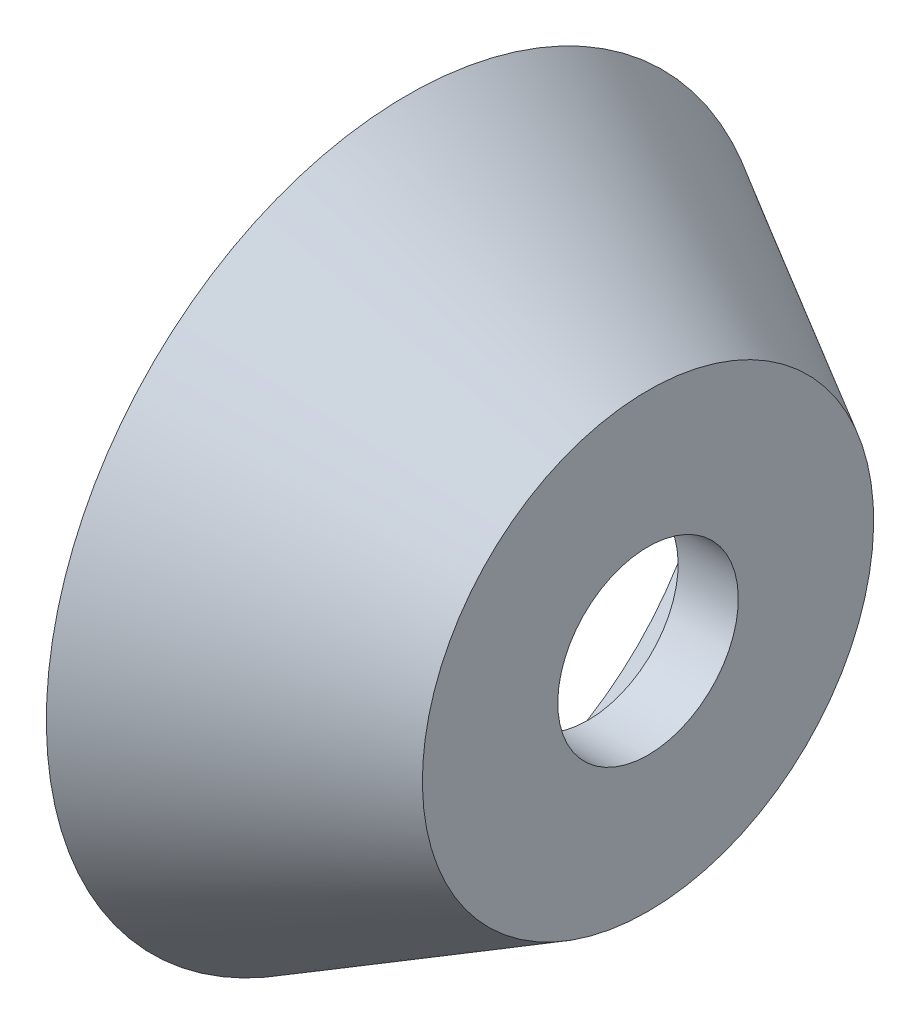
ISO-10303-21;
HEADER;
FILE_DESCRIPTION(('STEP AP214'),'2;1');
FILE_NAME('part.step','',(''),(''),'','','');
FILE_SCHEMA(('AUTOMOTIVE_DESIGN { 1 0 10303 214 1 1 1 1 }'));
ENDSEC;
DATA;
#1=APPLICATION_CONTEXT('core data for automotive mechanical design processes');
#2=APPLICATION_PROTOCOL_DEFINITION('international standard','automotive_design',2000,#1);
#3=PRODUCT_CONTEXT('',#1,'mechanical');
#4=PRODUCT('Part','Part','',(#3));
#5=PRODUCT_RELATED_PRODUCT_CATEGORY('part','',(#4));
#6=PRODUCT_DEFINITION_FORMATION('','',#4);
#7=PRODUCT_DEFINITION_CONTEXT('part definition',#1,'design');
#8=PRODUCT_DEFINITION('design','',#6,#7);
#9=PRODUCT_DEFINITION_SHAPE('','',#8);
#10=(LENGTH_UNIT() NAMED_UNIT(*) SI_UNIT(.MILLI.,.METRE.));
#11=(NAMED_UNIT(*) PLANE_ANGLE_UNIT() SI_UNIT($,.RADIAN.));
#12=(NAMED_UNIT(*) SI_UNIT($,.STERADIAN.) SOLID_ANGLE_UNIT());
#13=UNCERTAINTY_MEASURE_WITH_UNIT(LENGTH_MEASURE(1.E-05),#10,'distance_accuracy_value','');
#14=(GEOMETRIC_REPRESENTATION_CONTEXT(3) GLOBAL_UNCERTAINTY_ASSIGNED_CONTEXT((#13)) GLOBAL_UNIT_ASSIGNED_CONTEXT((#10,
#11,#12)) REPRESENTATION_CONTEXT('',''));
#15=CARTESIAN_POINT('',(0.,0.,0.));
#16=DIRECTION('',(0.,0.,1.));
#17=DIRECTION('',(1.,0.,0.));
#18=AXIS2_PLACEMENT_3D('',#15,#16,#17);
#19=CARTESIAN_POINT('',(6.35,4.7625,0.));
#20=DIRECTION('',(-1.,0.,0.));
#21=DIRECTION('',(0.,-1.,0.));
#22=AXIS2_PLACEMENT_3D('',#19,#20,#21);
#23=PLANE('',#22);
#24=CARTESIAN_POINT('',(6.35,0.,0.));
#25=DIRECTION('',(-1.,0.,0.));
#26=DIRECTION('',(0.,-1.,0.));
#27=AXIS2_PLACEMENT_3D('',#24,#25,#26);
#28=CIRCLE('',#27,11.90625);
#29=CARTESIAN_POINT('',(6.35,-11.90625,0.));
#30=VERTEX_POINT('',#29);
#31=EDGE_CURVE('E64',#30,#30,#28,.T.);
#32=ORIENTED_EDGE('',*,*,#31,.F.);
#33=EDGE_LOOP('',(#32));
#34=FACE_BOUND('',#33,.T.);
#35=CARTESIAN_POINT('',(6.35,0.,0.));
#36=DIRECTION('',(-1.,0.,0.));
#37=DIRECTION('',(0.,-1.,0.));
#38=AXIS2_PLACEMENT_3D('',#35,#36,#37);
#39=CIRCLE('',#38,4.7625);
#40=CARTESIAN_POINT('',(6.35,-4.76250000000001,0.));
#41=VERTEX_POINT('',#40);
#42=EDGE_CURVE('E10',#41,#41,#39,.T.);
#43=ORIENTED_EDGE('',*,*,#42,.T.);
#44=EDGE_LOOP('',(#43));
#45=FACE_BOUND('',#44,.T.);
#46=ADVANCED_FACE('F36',(#34,#45),#23,.F.);
#47=CARTESIAN_POINT('',(-6.35000000000001,0.,0.));
#48=DIRECTION('',(-1.,0.,0.));
#49=DIRECTION('',(0.,-1.,0.));
#50=AXIS2_PLACEMENT_3D('',#47,#48,#49);
#51=CYLINDRICAL_SURFACE('',#50,4.7625);
#52=ORIENTED_EDGE('',*,*,#42,.F.);
#53=EDGE_LOOP('',(#52));
#54=FACE_BOUND('',#53,.T.);
#55=CARTESIAN_POINT('',(3.175,0.,0.));
#56=DIRECTION('',(-1.,0.,0.));
#57=DIRECTION('',(0.,-1.,0.));
#58=AXIS2_PLACEMENT_3D('',#55,#56,#57);
#59=CIRCLE('',#58,4.7625);
#60=CARTESIAN_POINT('',(3.175,-4.7625,0.));
#61=VERTEX_POINT('',#60);
#62=EDGE_CURVE('E43',#61,#61,#59,.T.);
#63=ORIENTED_EDGE('',*,*,#62,.T.);
#64=EDGE_LOOP('',(#63));
#65=FACE_BOUND('',#64,.T.);
#66=ADVANCED_FACE('F71',(#54,#65),#51,.F.);
#67=CARTESIAN_POINT('',(3.175,10.0493592369733,0.));
#68=DIRECTION('',(1.,0.,0.));
#69=DIRECTION('',(0.,1.,0.));
#70=AXIS2_PLACEMENT_3D('',#67,#68,#69);
#71=PLANE('',#70);
#72=ORIENTED_EDGE('',*,*,#62,.F.);
#73=EDGE_LOOP('',(#72));
#74=FACE_BOUND('',#73,.T.);
#75=CARTESIAN_POINT('',(3.175,0.,0.));
#76=DIRECTION('',(-1.,0.,0.));
#77=DIRECTION('',(0.,-1.,0.));
#78=AXIS2_PLACEMENT_3D('',#75,#76,#77);
#79=CIRCLE('',#78,10.0493592369733);
#80=CARTESIAN_POINT('',(3.175,-10.0493592369733,0.));
#81=VERTEX_POINT('',#80);
#82=EDGE_CURVE('E50',#81,#81,#79,.T.);
#83=ORIENTED_EDGE('',*,*,#82,.T.);
#84=EDGE_LOOP('',(#83));
#85=FACE_BOUND('',#84,.T.);
#86=ADVANCED_FACE('F75',(#74,#85),#71,.F.);
#87=CARTESIAN_POINT('',(-4.23333333333334,0.,0.));
#88=DIRECTION('',(-1.,0.,0.));
#89=DIRECTION('',(0.,-1.,0.));
#90=AXIS2_PLACEMENT_3D('',#87,#88,#89);
#91=CONICAL_SURFACE('',#90,14.2165467369733,0.512389460310737);
#92=ORIENTED_EDGE('',*,*,#82,.F.);
#93=EDGE_LOOP('',(#92));
#94=FACE_BOUND('',#93,.T.);
#95=CARTESIAN_POINT('',(-4.23333333333334,0.,0.));
#96=DIRECTION('',(-1.,0.,0.));
#97=DIRECTION('',(0.,-1.,0.));
#98=AXIS2_PLACEMENT_3D('',#95,#96,#97);
#99=CIRCLE('',#98,14.2165467369733);
#100=CARTESIAN_POINT('',(-4.23333333333334,-14.2165467369733,0.));
#101=VERTEX_POINT('',#100);
#102=EDGE_CURVE('E55',#101,#101,#99,.T.);
#103=ORIENTED_EDGE('',*,*,#102,.T.);
#104=EDGE_LOOP('',(#103));
#105=FACE_BOUND('',#104,.T.);
#106=ADVANCED_FACE('F80',(#94,#105),#91,.F.);
#107=CARTESIAN_POINT('',(-6.35,0.,0.));
#108=DIRECTION('',(-1.,0.,0.));
#109=DIRECTION('',(0.,-1.,0.));
#110=AXIS2_PLACEMENT_3D('',#107,#108,#109);
#111=CONICAL_SURFACE('',#110,19.05,1.15803327372149);
#112=ORIENTED_EDGE('',*,*,#102,.F.);
#113=EDGE_LOOP('',(#112));
#114=FACE_BOUND('',#113,.T.);
#115=CARTESIAN_POINT('',(-6.35,0.,0.));
#116=DIRECTION('',(-1.,0.,0.));
#117=DIRECTION('',(0.,-1.,0.));
#118=AXIS2_PLACEMENT_3D('',#115,#116,#117);
#119=CIRCLE('',#118,19.05);
#120=CARTESIAN_POINT('',(-6.35,-19.05,0.));
#121=VERTEX_POINT('',#120);
#122=EDGE_CURVE('E61',#121,#121,#119,.T.);
#123=ORIENTED_EDGE('',*,*,#122,.T.);
#124=EDGE_LOOP('',(#123));
#125=FACE_BOUND('',#124,.T.);
#126=ADVANCED_FACE('F86',(#114,#125),#111,.F.);
#127=CARTESIAN_POINT('',(6.35,0.,0.));
#128=DIRECTION('',(-1.,0.,0.));
#129=DIRECTION('',(0.,-1.,0.));
#130=AXIS2_PLACEMENT_3D('',#127,#128,#129);
#131=CONICAL_SURFACE('',#130,11.90625,0.512389460310737);
#132=ORIENTED_EDGE('',*,*,#122,.F.);
#133=EDGE_LOOP('',(#132));
#134=FACE_BOUND('',#133,.T.);
#135=ORIENTED_EDGE('',*,*,#31,.T.);
#136=EDGE_LOOP('',(#135));
#137=FACE_BOUND('',#136,.T.);
#138=ADVANCED_FACE('F68',(#134,#137),#131,.T.);
#139=CLOSED_SHELL('',(#46,#66,#86,#106,#126,#138));
#140=MANIFOLD_SOLID_BREP('B2',#139);
#141=ADVANCED_BREP_SHAPE_REPRESENTATION('',(#18,#140),#14);
#142=SHAPE_DEFINITION_REPRESENTATION(#9,#141);
ENDSEC;
END-ISO-10303-21;
